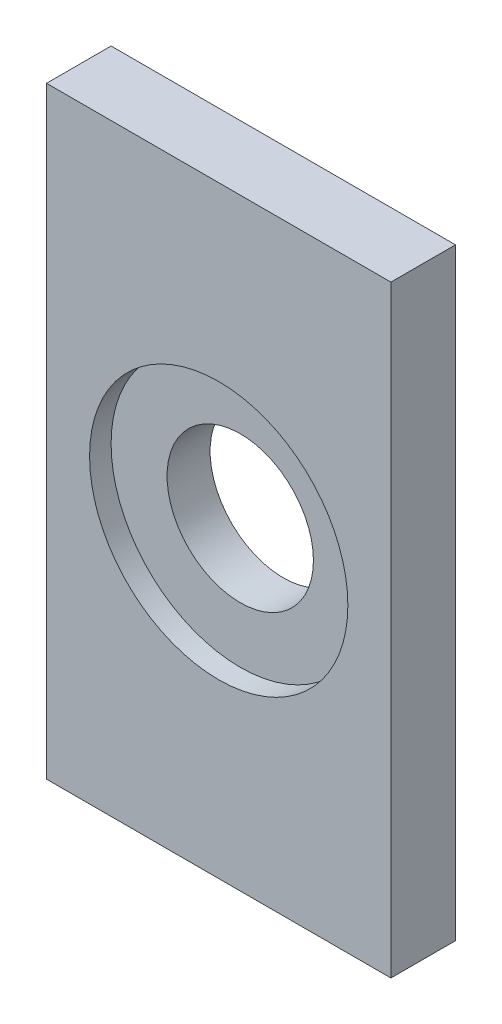
ISO-10303-21;
HEADER;
FILE_DESCRIPTION(('STEP AP214'),'2;1');
FILE_NAME('part.step','',(''),(''),'','','');
FILE_SCHEMA(('AUTOMOTIVE_DESIGN { 1 0 10303 214 1 1 1 1 }'));
ENDSEC;
DATA;
#1=APPLICATION_CONTEXT('core data for automotive mechanical design processes');
#2=APPLICATION_PROTOCOL_DEFINITION('international standard','automotive_design',2000,#1);
#3=PRODUCT_CONTEXT('',#1,'mechanical');
#4=PRODUCT('Part','Part','',(#3));
#5=PRODUCT_RELATED_PRODUCT_CATEGORY('part','',(#4));
#6=PRODUCT_DEFINITION_FORMATION('','',#4);
#7=PRODUCT_DEFINITION_CONTEXT('part definition',#1,'design');
#8=PRODUCT_DEFINITION('design','',#6,#7);
#9=PRODUCT_DEFINITION_SHAPE('','',#8);
#10=(LENGTH_UNIT() NAMED_UNIT(*) SI_UNIT(.MILLI.,.METRE.));
#11=(NAMED_UNIT(*) PLANE_ANGLE_UNIT() SI_UNIT($,.RADIAN.));
#12=(NAMED_UNIT(*) SI_UNIT($,.STERADIAN.) SOLID_ANGLE_UNIT());
#13=UNCERTAINTY_MEASURE_WITH_UNIT(LENGTH_MEASURE(1.E-05),#10,'distance_accuracy_value','');
#14=(GEOMETRIC_REPRESENTATION_CONTEXT(3) GLOBAL_UNCERTAINTY_ASSIGNED_CONTEXT((#13)) GLOBAL_UNIT_ASSIGNED_CONTEXT((#10,
#11,#12)) REPRESENTATION_CONTEXT('',''));
#15=CARTESIAN_POINT('',(0.,0.,0.));
#16=DIRECTION('',(0.,0.,1.));
#17=DIRECTION('',(1.,0.,0.));
#18=AXIS2_PLACEMENT_3D('',#15,#16,#17);
#19=CARTESIAN_POINT('',(0.,0.,1.5));
#20=DIRECTION('',(0.,0.,-1.));
#21=DIRECTION('',(-1.,0.,0.));
#22=AXIS2_PLACEMENT_3D('',#19,#20,#21);
#23=CYLINDRICAL_SURFACE('',#22,1.7);
#24=CARTESIAN_POINT('',(0.,0.,0.));
#25=DIRECTION('',(0.,0.,1.));
#26=DIRECTION('',(1.,0.,0.));
#27=AXIS2_PLACEMENT_3D('',#24,#25,#26);
#28=CIRCLE('',#27,1.7);
#29=CARTESIAN_POINT('',(1.7,0.,0.));
#30=VERTEX_POINT('',#29);
#31=EDGE_CURVE('E101',#30,#30,#28,.T.);
#32=ORIENTED_EDGE('',*,*,#31,.F.);
#33=EDGE_LOOP('',(#32));
#34=FACE_BOUND('',#33,.T.);
#35=CARTESIAN_POINT('',(0.,0.,1.));
#36=DIRECTION('',(0.,0.,1.));
#37=DIRECTION('',(1.,0.,0.));
#38=AXIS2_PLACEMENT_3D('',#35,#36,#37);
#39=CIRCLE('',#38,1.7);
#40=CARTESIAN_POINT('',(1.7,0.,1.));
#41=VERTEX_POINT('',#40);
#42=EDGE_CURVE('E36',#41,#41,#39,.T.);
#43=ORIENTED_EDGE('',*,*,#42,.T.);
#44=EDGE_LOOP('',(#43));
#45=FACE_BOUND('',#44,.T.);
#46=ADVANCED_FACE('F32',(#34,#45),#23,.F.);
#47=CARTESIAN_POINT('',(0.,0.,1.5));
#48=DIRECTION('',(0.,0.,-1.));
#49=DIRECTION('',(-1.,0.,0.));
#50=AXIS2_PLACEMENT_3D('',#47,#48,#49);
#51=PLANE('',#50);
#52=CARTESIAN_POINT('',(0.,0.,1.5));
#53=DIRECTION('',(0.,0.,1.));
#54=DIRECTION('',(1.,0.,0.));
#55=AXIS2_PLACEMENT_3D('',#52,#53,#54);
#56=CIRCLE('',#55,3.);
#57=CARTESIAN_POINT('',(3.,0.,1.5));
#58=VERTEX_POINT('',#57);
#59=EDGE_CURVE('E115',#58,#58,#56,.T.);
#60=ORIENTED_EDGE('',*,*,#59,.F.);
#61=EDGE_LOOP('',(#60));
#62=FACE_BOUND('',#61,.T.);
#63=DIRECTION('',(0.,1.,0.));
#64=VECTOR('',#63,1.);
#65=CARTESIAN_POINT('',(4.,-7.,1.5));
#66=LINE('',#65,#64);
#67=CARTESIAN_POINT('',(4.,-7.,1.5));
#68=VERTEX_POINT('',#67);
#69=CARTESIAN_POINT('',(4.,7.,1.5));
#70=VERTEX_POINT('',#69);
#71=EDGE_CURVE('E85',#68,#70,#66,.T.);
#72=ORIENTED_EDGE('',*,*,#71,.T.);
#73=DIRECTION('',(-1.,0.,0.));
#74=VECTOR('',#73,1.);
#75=CARTESIAN_POINT('',(-4.,7.,1.5));
#76=LINE('',#75,#74);
#77=CARTESIAN_POINT('',(-4.,7.,1.5));
#78=VERTEX_POINT('',#77);
#79=EDGE_CURVE('E80',#70,#78,#76,.T.);
#80=ORIENTED_EDGE('',*,*,#79,.T.);
#81=DIRECTION('',(0.,-1.,0.));
#82=VECTOR('',#81,1.);
#83=CARTESIAN_POINT('',(-4.,-7.,1.5));
#84=LINE('',#83,#82);
#85=CARTESIAN_POINT('',(-4.,-7.,1.5));
#86=VERTEX_POINT('',#85);
#87=EDGE_CURVE('E83',#78,#86,#84,.T.);
#88=ORIENTED_EDGE('',*,*,#87,.T.);
#89=DIRECTION('',(1.,0.,0.));
#90=VECTOR('',#89,1.);
#91=CARTESIAN_POINT('',(-4.,-7.,1.5));
#92=LINE('',#91,#90);
#93=EDGE_CURVE('E50',#86,#68,#92,.T.);
#94=ORIENTED_EDGE('',*,*,#93,.T.);
#95=EDGE_LOOP('',(#72,#80,#88,#94));
#96=FACE_BOUND('',#95,.T.);
#97=ADVANCED_FACE('F81',(#62,#96),#51,.F.);
#98=CARTESIAN_POINT('',(0.,0.,0.));
#99=DIRECTION('',(0.,0.,-1.));
#100=DIRECTION('',(-1.,0.,0.));
#101=AXIS2_PLACEMENT_3D('',#98,#99,#100);
#102=PLANE('',#101);
#103=DIRECTION('',(0.,1.,0.));
#104=VECTOR('',#103,1.);
#105=CARTESIAN_POINT('',(4.,-7.,0.));
#106=LINE('',#105,#104);
#107=CARTESIAN_POINT('',(4.,-7.,0.));
#108=VERTEX_POINT('',#107);
#109=CARTESIAN_POINT('',(4.,7.,0.));
#110=VERTEX_POINT('',#109);
#111=EDGE_CURVE('E98',#108,#110,#106,.T.);
#112=ORIENTED_EDGE('',*,*,#111,.F.);
#113=DIRECTION('',(1.,0.,0.));
#114=VECTOR('',#113,1.);
#115=CARTESIAN_POINT('',(-4.,-7.,0.));
#116=LINE('',#115,#114);
#117=CARTESIAN_POINT('',(-4.,-7.,0.));
#118=VERTEX_POINT('',#117);
#119=EDGE_CURVE('E73',#118,#108,#116,.T.);
#120=ORIENTED_EDGE('',*,*,#119,.F.);
#121=DIRECTION('',(0.,-1.,0.));
#122=VECTOR('',#121,1.);
#123=CARTESIAN_POINT('',(-4.,-7.,0.));
#124=LINE('',#123,#122);
#125=CARTESIAN_POINT('',(-4.,7.,0.));
#126=VERTEX_POINT('',#125);
#127=EDGE_CURVE('E67',#126,#118,#124,.T.);
#128=ORIENTED_EDGE('',*,*,#127,.F.);
#129=DIRECTION('',(-1.,0.,0.));
#130=VECTOR('',#129,1.);
#131=CARTESIAN_POINT('',(-4.,7.,0.));
#132=LINE('',#131,#130);
#133=EDGE_CURVE('E89',#110,#126,#132,.T.);
#134=ORIENTED_EDGE('',*,*,#133,.F.);
#135=EDGE_LOOP('',(#112,#120,#128,#134));
#136=FACE_BOUND('',#135,.T.);
#137=ORIENTED_EDGE('',*,*,#31,.T.);
#138=EDGE_LOOP('',(#137));
#139=FACE_BOUND('',#138,.T.);
#140=ADVANCED_FACE('F109',(#136,#139),#102,.T.);
#141=CARTESIAN_POINT('',(4.,-7.,1.5));
#142=DIRECTION('',(-1.,0.,0.));
#143=DIRECTION('',(0.,0.,1.));
#144=AXIS2_PLACEMENT_3D('',#141,#142,#143);
#145=PLANE('',#144);
#146=ORIENTED_EDGE('',*,*,#111,.T.);
#147=DIRECTION('',(0.,0.,-1.));
#148=VECTOR('',#147,1.);
#149=CARTESIAN_POINT('',(4.,7.,1.5));
#150=LINE('',#149,#148);
#151=EDGE_CURVE('E11',#70,#110,#150,.T.);
#152=ORIENTED_EDGE('',*,*,#151,.F.);
#153=ORIENTED_EDGE('',*,*,#71,.F.);
#154=DIRECTION('',(0.,0.,-1.));
#155=VECTOR('',#154,1.);
#156=CARTESIAN_POINT('',(4.,-7.,1.5));
#157=LINE('',#156,#155);
#158=EDGE_CURVE('E94',#68,#108,#157,.T.);
#159=ORIENTED_EDGE('',*,*,#158,.T.);
#160=EDGE_LOOP('',(#146,#152,#153,#159));
#161=FACE_BOUND('',#160,.T.);
#162=ADVANCED_FACE('F34',(#161),#145,.F.);
#163=CARTESIAN_POINT('',(-4.,7.,1.5));
#164=DIRECTION('',(0.,-1.,0.));
#165=DIRECTION('',(0.,0.,-1.));
#166=AXIS2_PLACEMENT_3D('',#163,#164,#165);
#167=PLANE('',#166);
#168=ORIENTED_EDGE('',*,*,#133,.T.);
#169=DIRECTION('',(0.,0.,-1.));
#170=VECTOR('',#169,1.);
#171=CARTESIAN_POINT('',(-4.,7.,1.5));
#172=LINE('',#171,#170);
#173=EDGE_CURVE('E42',#78,#126,#172,.T.);
#174=ORIENTED_EDGE('',*,*,#173,.F.);
#175=ORIENTED_EDGE('',*,*,#79,.F.);
#176=ORIENTED_EDGE('',*,*,#151,.T.);
#177=EDGE_LOOP('',(#168,#174,#175,#176));
#178=FACE_BOUND('',#177,.T.);
#179=ADVANCED_FACE('F88',(#178),#167,.F.);
#180=CARTESIAN_POINT('',(-4.,-7.,1.5));
#181=DIRECTION('',(1.,0.,0.));
#182=DIRECTION('',(0.,0.,-1.));
#183=AXIS2_PLACEMENT_3D('',#180,#181,#182);
#184=PLANE('',#183);
#185=ORIENTED_EDGE('',*,*,#127,.T.);
#186=DIRECTION('',(0.,0.,-1.));
#187=VECTOR('',#186,1.);
#188=CARTESIAN_POINT('',(-4.,-7.,1.5));
#189=LINE('',#188,#187);
#190=EDGE_CURVE('E90',#86,#118,#189,.T.);
#191=ORIENTED_EDGE('',*,*,#190,.F.);
#192=ORIENTED_EDGE('',*,*,#87,.F.);
#193=ORIENTED_EDGE('',*,*,#173,.T.);
#194=EDGE_LOOP('',(#185,#191,#192,#193));
#195=FACE_BOUND('',#194,.T.);
#196=ADVANCED_FACE('F92',(#195),#184,.F.);
#197=CARTESIAN_POINT('',(-4.,-7.,1.5));
#198=DIRECTION('',(0.,1.,0.));
#199=DIRECTION('',(0.,0.,1.));
#200=AXIS2_PLACEMENT_3D('',#197,#198,#199);
#201=PLANE('',#200);
#202=ORIENTED_EDGE('',*,*,#119,.T.);
#203=ORIENTED_EDGE('',*,*,#158,.F.);
#204=ORIENTED_EDGE('',*,*,#93,.F.);
#205=ORIENTED_EDGE('',*,*,#190,.T.);
#206=EDGE_LOOP('',(#202,#203,#204,#205));
#207=FACE_BOUND('',#206,.T.);
#208=ADVANCED_FACE('F106',(#207),#201,.F.);
#209=CARTESIAN_POINT('',(0.,0.,1.));
#210=DIRECTION('',(0.,0.,1.));
#211=DIRECTION('',(1.,0.,0.));
#212=AXIS2_PLACEMENT_3D('',#209,#210,#211);
#213=CYLINDRICAL_SURFACE('',#212,3.);
#214=CARTESIAN_POINT('',(0.,0.,1.));
#215=DIRECTION('',(0.,0.,1.));
#216=DIRECTION('',(1.,0.,0.));
#217=AXIS2_PLACEMENT_3D('',#214,#215,#216);
#218=CIRCLE('',#217,3.);
#219=CARTESIAN_POINT('',(3.,0.,1.));
#220=VERTEX_POINT('',#219);
#221=EDGE_CURVE('E118',#220,#220,#218,.T.);
#222=ORIENTED_EDGE('',*,*,#221,.F.);
#223=EDGE_LOOP('',(#222));
#224=FACE_BOUND('',#223,.T.);
#225=ORIENTED_EDGE('',*,*,#59,.T.);
#226=EDGE_LOOP('',(#225));
#227=FACE_BOUND('',#226,.T.);
#228=ADVANCED_FACE('F128',(#224,#227),#213,.F.);
#229=CARTESIAN_POINT('',(0.,0.,1.));
#230=DIRECTION('',(0.,0.,1.));
#231=DIRECTION('',(1.,0.,0.));
#232=AXIS2_PLACEMENT_3D('',#229,#230,#231);
#233=PLANE('',#232);
#234=ORIENTED_EDGE('',*,*,#42,.F.);
#235=EDGE_LOOP('',(#234));
#236=FACE_BOUND('',#235,.T.);
#237=ORIENTED_EDGE('',*,*,#221,.T.);
#238=EDGE_LOOP('',(#237));
#239=FACE_BOUND('',#238,.T.);
#240=ADVANCED_FACE('F126',(#236,#239),#233,.T.);
#241=CLOSED_SHELL('',(#46,#97,#140,#162,#179,#196,#208,#228,#240));
#242=MANIFOLD_SOLID_BREP('B2',#241);
#243=ADVANCED_BREP_SHAPE_REPRESENTATION('',(#18,#242),#14);
#244=SHAPE_DEFINITION_REPRESENTATION(#9,#243);
ENDSEC;
END-ISO-10303-21;
